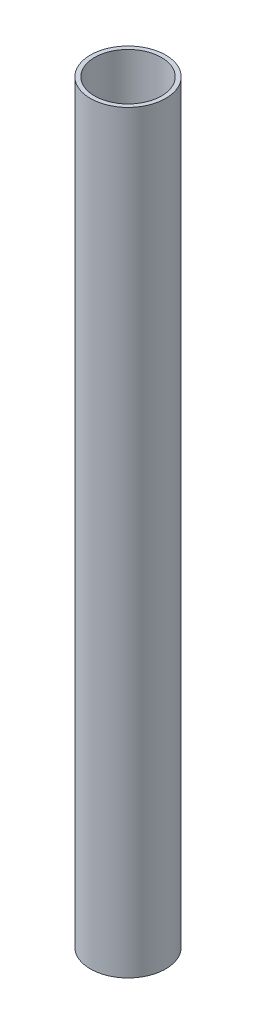
ISO-10303-21;
HEADER;
FILE_DESCRIPTION(('STEP AP214'),'2;1');
FILE_NAME('part.step','',(''),(''),'','','');
FILE_SCHEMA(('AUTOMOTIVE_DESIGN { 1 0 10303 214 1 1 1 1 }'));
ENDSEC;
DATA;
#1=APPLICATION_CONTEXT('core data for automotive mechanical design processes');
#2=APPLICATION_PROTOCOL_DEFINITION('international standard','automotive_design',2000,#1);
#3=PRODUCT_CONTEXT('',#1,'mechanical');
#4=PRODUCT('Part','Part','',(#3));
#5=PRODUCT_RELATED_PRODUCT_CATEGORY('part','',(#4));
#6=PRODUCT_DEFINITION_FORMATION('','',#4);
#7=PRODUCT_DEFINITION_CONTEXT('part definition',#1,'design');
#8=PRODUCT_DEFINITION('design','',#6,#7);
#9=PRODUCT_DEFINITION_SHAPE('','',#8);
#10=(LENGTH_UNIT() NAMED_UNIT(*) SI_UNIT(.MILLI.,.METRE.));
#11=(NAMED_UNIT(*) PLANE_ANGLE_UNIT() SI_UNIT($,.RADIAN.));
#12=(NAMED_UNIT(*) SI_UNIT($,.STERADIAN.) SOLID_ANGLE_UNIT());
#13=UNCERTAINTY_MEASURE_WITH_UNIT(LENGTH_MEASURE(1.E-05),#10,'distance_accuracy_value','');
#14=(GEOMETRIC_REPRESENTATION_CONTEXT(3) GLOBAL_UNCERTAINTY_ASSIGNED_CONTEXT((#13)) GLOBAL_UNIT_ASSIGNED_CONTEXT((#10,
#11,#12)) REPRESENTATION_CONTEXT('',''));
#15=CARTESIAN_POINT('',(0.,0.,0.));
#16=DIRECTION('',(0.,0.,1.));
#17=DIRECTION('',(1.,0.,0.));
#18=AXIS2_PLACEMENT_3D('',#15,#16,#17);
#19=CARTESIAN_POINT('',(0.,159.,0.));
#20=DIRECTION('',(0.,1.,0.));
#21=DIRECTION('',(0.,0.,1.));
#22=AXIS2_PLACEMENT_3D('',#19,#20,#21);
#23=PLANE('',#22);
#24=CARTESIAN_POINT('',(0.,159.,0.));
#25=DIRECTION('',(0.,1.,0.));
#26=DIRECTION('',(0.,0.,1.));
#27=AXIS2_PLACEMENT_3D('',#24,#25,#26);
#28=CIRCLE('',#27,7.9375);
#29=CARTESIAN_POINT('',(0.,159.,-7.9375));
#30=VERTEX_POINT('',#29);
#31=EDGE_CURVE('E10',#30,#30,#28,.T.);
#32=ORIENTED_EDGE('',*,*,#31,.T.);
#33=EDGE_LOOP('',(#32));
#34=FACE_BOUND('',#33,.T.);
#35=CARTESIAN_POINT('',(0.,159.,0.));
#36=DIRECTION('',(0.,1.,0.));
#37=DIRECTION('',(0.,0.,1.));
#38=AXIS2_PLACEMENT_3D('',#35,#36,#37);
#39=CIRCLE('',#38,7.0485);
#40=CARTESIAN_POINT('',(0.,159.,-7.0485));
#41=VERTEX_POINT('',#40);
#42=EDGE_CURVE('E44',#41,#41,#39,.T.);
#43=ORIENTED_EDGE('',*,*,#42,.F.);
#44=EDGE_LOOP('',(#43));
#45=FACE_BOUND('',#44,.T.);
#46=ADVANCED_FACE('F33',(#34,#45),#23,.T.);
#47=CARTESIAN_POINT('',(0.,0.,0.));
#48=DIRECTION('',(0.,1.,0.));
#49=DIRECTION('',(0.,0.,1.));
#50=AXIS2_PLACEMENT_3D('',#47,#48,#49);
#51=PLANE('',#50);
#52=CARTESIAN_POINT('',(0.,0.,0.));
#53=DIRECTION('',(0.,1.,0.));
#54=DIRECTION('',(0.,0.,1.));
#55=AXIS2_PLACEMENT_3D('',#52,#53,#54);
#56=CIRCLE('',#55,7.9375);
#57=CARTESIAN_POINT('',(0.,0.,-7.9375));
#58=VERTEX_POINT('',#57);
#59=EDGE_CURVE('E37',#58,#58,#56,.T.);
#60=ORIENTED_EDGE('',*,*,#59,.F.);
#61=EDGE_LOOP('',(#60));
#62=FACE_BOUND('',#61,.T.);
#63=CARTESIAN_POINT('',(0.,0.,0.));
#64=DIRECTION('',(0.,1.,0.));
#65=DIRECTION('',(0.,0.,1.));
#66=AXIS2_PLACEMENT_3D('',#63,#64,#65);
#67=CIRCLE('',#66,7.0485);
#68=CARTESIAN_POINT('',(0.,0.,-7.0485));
#69=VERTEX_POINT('',#68);
#70=EDGE_CURVE('E46',#69,#69,#67,.T.);
#71=ORIENTED_EDGE('',*,*,#70,.T.);
#72=EDGE_LOOP('',(#71));
#73=FACE_BOUND('',#72,.T.);
#74=ADVANCED_FACE('F56',(#62,#73),#51,.F.);
#75=CARTESIAN_POINT('',(0.,159.,0.));
#76=DIRECTION('',(0.,-1.,0.));
#77=DIRECTION('',(0.,0.,-1.));
#78=AXIS2_PLACEMENT_3D('',#75,#76,#77);
#79=CYLINDRICAL_SURFACE('',#78,7.9375);
#80=CARTESIAN_POINT('',(0.,159.,-7.9375));
#81=CARTESIAN_POINT('',(0.,157.34375,-7.9375));
#82=CARTESIAN_POINT('',(0.,155.6875,-7.9375));
#83=CARTESIAN_POINT('',(0.,152.375,-7.9375));
#84=CARTESIAN_POINT('',(0.,150.71875,-7.9375));
#85=CARTESIAN_POINT('',(0.,147.40625,-7.9375));
#86=CARTESIAN_POINT('',(0.,145.75,-7.9375));
#87=CARTESIAN_POINT('',(0.,142.4375,-7.9375));
#88=CARTESIAN_POINT('',(0.,140.78125,-7.9375));
#89=CARTESIAN_POINT('',(0.,137.46875,-7.9375));
#90=CARTESIAN_POINT('',(0.,135.8125,-7.9375));
#91=CARTESIAN_POINT('',(0.,132.5,-7.9375));
#92=CARTESIAN_POINT('',(0.,130.84375,-7.9375));
#93=CARTESIAN_POINT('',(0.,127.53125,-7.9375));
#94=CARTESIAN_POINT('',(0.,125.875,-7.9375));
#95=CARTESIAN_POINT('',(0.,122.5625,-7.9375));
#96=CARTESIAN_POINT('',(0.,120.90625,-7.9375));
#97=CARTESIAN_POINT('',(0.,117.59375,-7.9375));
#98=CARTESIAN_POINT('',(0.,115.9375,-7.9375));
#99=CARTESIAN_POINT('',(0.,112.625,-7.9375));
#100=CARTESIAN_POINT('',(0.,110.96875,-7.9375));
#101=CARTESIAN_POINT('',(0.,107.65625,-7.9375));
#102=CARTESIAN_POINT('',(0.,106.,-7.9375));
#103=CARTESIAN_POINT('',(0.,102.6875,-7.9375));
#104=CARTESIAN_POINT('',(0.,101.03125,-7.9375));
#105=CARTESIAN_POINT('',(0.,97.71875,-7.9375));
#106=CARTESIAN_POINT('',(0.,96.0625,-7.9375));
#107=CARTESIAN_POINT('',(0.,92.75,-7.9375));
#108=CARTESIAN_POINT('',(0.,91.09375,-7.9375));
#109=CARTESIAN_POINT('',(0.,87.78125,-7.9375));
#110=CARTESIAN_POINT('',(0.,86.125,-7.9375));
#111=CARTESIAN_POINT('',(0.,82.8125,-7.9375));
#112=CARTESIAN_POINT('',(0.,81.15625,-7.9375));
#113=CARTESIAN_POINT('',(0.,77.84375,-7.9375));
#114=CARTESIAN_POINT('',(0.,76.1875,-7.9375));
#115=CARTESIAN_POINT('',(0.,72.875,-7.9375));
#116=CARTESIAN_POINT('',(0.,71.21875,-7.9375));
#117=CARTESIAN_POINT('',(0.,67.90625,-7.9375));
#118=CARTESIAN_POINT('',(0.,66.25,-7.9375));
#119=CARTESIAN_POINT('',(0.,62.9375,-7.9375));
#120=CARTESIAN_POINT('',(0.,61.28125,-7.9375));
#121=CARTESIAN_POINT('',(0.,57.96875,-7.9375));
#122=CARTESIAN_POINT('',(0.,56.3125,-7.9375));
#123=CARTESIAN_POINT('',(0.,53.,-7.9375));
#124=CARTESIAN_POINT('',(0.,51.34375,-7.9375));
#125=CARTESIAN_POINT('',(0.,48.03125,-7.9375));
#126=CARTESIAN_POINT('',(0.,46.375,-7.9375));
#127=CARTESIAN_POINT('',(0.,43.0625,-7.9375));
#128=CARTESIAN_POINT('',(0.,41.40625,-7.9375));
#129=CARTESIAN_POINT('',(0.,38.09375,-7.9375));
#130=CARTESIAN_POINT('',(0.,36.4375,-7.9375));
#131=CARTESIAN_POINT('',(0.,33.125,-7.9375));
#132=CARTESIAN_POINT('',(0.,31.46875,-7.9375));
#133=CARTESIAN_POINT('',(0.,28.15625,-7.9375));
#134=CARTESIAN_POINT('',(0.,26.5,-7.9375));
#135=CARTESIAN_POINT('',(0.,23.1875,-7.9375));
#136=CARTESIAN_POINT('',(0.,21.53125,-7.9375));
#137=CARTESIAN_POINT('',(0.,18.21875,-7.9375));
#138=CARTESIAN_POINT('',(0.,16.5625,-7.9375));
#139=CARTESIAN_POINT('',(0.,13.25,-7.9375));
#140=CARTESIAN_POINT('',(0.,11.59375,-7.9375));
#141=CARTESIAN_POINT('',(0.,8.28124999999999,-7.9375));
#142=CARTESIAN_POINT('',(0.,6.62499999999999,-7.9375));
#143=CARTESIAN_POINT('',(0.,3.3125,-7.9375));
#144=CARTESIAN_POINT('',(0.,1.65625,-7.9375));
#145=CARTESIAN_POINT('',(0.,0.,-7.9375));
#146=B_SPLINE_CURVE_WITH_KNOTS('',3,(#80,#81,#82,#83,#84,#85,#86,#87,#88,#89,#90,#91,#92,#93,
#94,#95,#96,#97,#98,#99,#100,#101,#102,#103,#104,#105,#106,#107,#108,#109,#110,#111,#112,#113,
#114,#115,#116,#117,#118,#119,#120,#121,#122,#123,#124,#125,#126,#127,#128,#129,#130,#131,#132,
#133,#134,#135,#136,#137,#138,#139,#140,#141,#142,#143,#144,#145),.UNSPECIFIED.,.F.,.F.,(4,2,2,
2,2,2,2,2,2,2,2,2,2,2,2,2,2,2,2,2,2,2,2,2,2,2,2,2,2,2,2,2,4),(0.,4.96875000000002,
9.93750000000002,14.90625,19.875,24.84375,29.8125,34.78125,39.75,44.71875,49.6875,54.65625,
59.625,64.59375,69.5625,74.53125,79.5,84.46875,89.4375,94.40625,99.375,104.34375,109.3125,
114.28125,119.25,124.21875,129.1875,134.15625,139.125,144.09375,149.0625,154.03125,159.),.UNSPECIFIED.);
#147=EDGE_CURVE('BSEAM35',#30,#58,#146,.T.);
#148=ORIENTED_EDGE('',*,*,#31,.F.);
#149=ORIENTED_EDGE('',*,*,#59,.T.);
#150=ORIENTED_EDGE('',*,*,#147,.T.);
#151=ORIENTED_EDGE('',*,*,#147,.F.);
#152=EDGE_LOOP('',(#148,#150,#149,#151));
#153=FACE_BOUND('',#152,.T.);
#154=ADVANCED_FACE('F35',(#153),#79,.T.);
#155=CARTESIAN_POINT('',(0.,159.,0.));
#156=DIRECTION('',(0.,-1.,0.));
#157=DIRECTION('',(0.,0.,-1.));
#158=AXIS2_PLACEMENT_3D('',#155,#156,#157);
#159=CYLINDRICAL_SURFACE('',#158,7.0485);
#160=CARTESIAN_POINT('',(0.,159.,-7.0485));
#161=CARTESIAN_POINT('',(0.,157.34375,-7.0485));
#162=CARTESIAN_POINT('',(0.,155.6875,-7.0485));
#163=CARTESIAN_POINT('',(0.,152.375,-7.0485));
#164=CARTESIAN_POINT('',(0.,150.71875,-7.0485));
#165=CARTESIAN_POINT('',(0.,147.40625,-7.0485));
#166=CARTESIAN_POINT('',(0.,145.75,-7.0485));
#167=CARTESIAN_POINT('',(0.,142.4375,-7.0485));
#168=CARTESIAN_POINT('',(0.,140.78125,-7.0485));
#169=CARTESIAN_POINT('',(0.,137.46875,-7.0485));
#170=CARTESIAN_POINT('',(0.,135.8125,-7.0485));
#171=CARTESIAN_POINT('',(0.,132.5,-7.0485));
#172=CARTESIAN_POINT('',(0.,130.84375,-7.0485));
#173=CARTESIAN_POINT('',(0.,127.53125,-7.0485));
#174=CARTESIAN_POINT('',(0.,125.875,-7.0485));
#175=CARTESIAN_POINT('',(0.,122.5625,-7.0485));
#176=CARTESIAN_POINT('',(0.,120.90625,-7.0485));
#177=CARTESIAN_POINT('',(0.,117.59375,-7.0485));
#178=CARTESIAN_POINT('',(0.,115.9375,-7.0485));
#179=CARTESIAN_POINT('',(0.,112.625,-7.0485));
#180=CARTESIAN_POINT('',(0.,110.96875,-7.0485));
#181=CARTESIAN_POINT('',(0.,107.65625,-7.0485));
#182=CARTESIAN_POINT('',(0.,106.,-7.0485));
#183=CARTESIAN_POINT('',(0.,102.6875,-7.0485));
#184=CARTESIAN_POINT('',(0.,101.03125,-7.0485));
#185=CARTESIAN_POINT('',(0.,97.71875,-7.0485));
#186=CARTESIAN_POINT('',(0.,96.0625,-7.0485));
#187=CARTESIAN_POINT('',(0.,92.75,-7.0485));
#188=CARTESIAN_POINT('',(0.,91.09375,-7.0485));
#189=CARTESIAN_POINT('',(0.,87.78125,-7.0485));
#190=CARTESIAN_POINT('',(0.,86.125,-7.0485));
#191=CARTESIAN_POINT('',(0.,82.8125,-7.0485));
#192=CARTESIAN_POINT('',(0.,81.15625,-7.0485));
#193=CARTESIAN_POINT('',(0.,77.84375,-7.0485));
#194=CARTESIAN_POINT('',(0.,76.1875,-7.0485));
#195=CARTESIAN_POINT('',(0.,72.875,-7.0485));
#196=CARTESIAN_POINT('',(0.,71.21875,-7.0485));
#197=CARTESIAN_POINT('',(0.,67.90625,-7.0485));
#198=CARTESIAN_POINT('',(0.,66.25,-7.0485));
#199=CARTESIAN_POINT('',(0.,62.9375,-7.0485));
#200=CARTESIAN_POINT('',(0.,61.28125,-7.0485));
#201=CARTESIAN_POINT('',(0.,57.96875,-7.0485));
#202=CARTESIAN_POINT('',(0.,56.3125,-7.0485));
#203=CARTESIAN_POINT('',(0.,53.,-7.0485));
#204=CARTESIAN_POINT('',(0.,51.34375,-7.0485));
#205=CARTESIAN_POINT('',(0.,48.03125,-7.0485));
#206=CARTESIAN_POINT('',(0.,46.375,-7.0485));
#207=CARTESIAN_POINT('',(0.,43.0625,-7.0485));
#208=CARTESIAN_POINT('',(0.,41.40625,-7.0485));
#209=CARTESIAN_POINT('',(0.,38.09375,-7.0485));
#210=CARTESIAN_POINT('',(0.,36.4375,-7.0485));
#211=CARTESIAN_POINT('',(0.,33.125,-7.0485));
#212=CARTESIAN_POINT('',(0.,31.46875,-7.0485));
#213=CARTESIAN_POINT('',(0.,28.15625,-7.0485));
#214=CARTESIAN_POINT('',(0.,26.5,-7.0485));
#215=CARTESIAN_POINT('',(0.,23.1875,-7.0485));
#216=CARTESIAN_POINT('',(0.,21.53125,-7.0485));
#217=CARTESIAN_POINT('',(0.,18.21875,-7.0485));
#218=CARTESIAN_POINT('',(0.,16.5625,-7.0485));
#219=CARTESIAN_POINT('',(0.,13.25,-7.0485));
#220=CARTESIAN_POINT('',(0.,11.59375,-7.0485));
#221=CARTESIAN_POINT('',(0.,8.28124999999999,-7.0485));
#222=CARTESIAN_POINT('',(0.,6.62499999999999,-7.0485));
#223=CARTESIAN_POINT('',(0.,3.3125,-7.0485));
#224=CARTESIAN_POINT('',(0.,1.65625,-7.0485));
#225=CARTESIAN_POINT('',(0.,0.,-7.0485));
#226=B_SPLINE_CURVE_WITH_KNOTS('',3,(#160,#161,#162,#163,#164,#165,#166,#167,#168,#169,#170,
#171,#172,#173,#174,#175,#176,#177,#178,#179,#180,#181,#182,#183,#184,#185,#186,#187,#188,#189,
#190,#191,#192,#193,#194,#195,#196,#197,#198,#199,#200,#201,#202,#203,#204,#205,#206,#207,#208,
#209,#210,#211,#212,#213,#214,#215,#216,#217,#218,#219,#220,#221,#222,#223,#224,#225),
.UNSPECIFIED.,.F.,.F.,(4,2,2,2,2,2,2,2,2,2,2,2,2,2,2,2,2,2,2,2,2,2,2,2,2,2,2,2,2,2,2,2,4),(0.,
4.96874999999999,9.93749999999999,14.90625,19.875,24.84375,29.8125,34.78125,39.75,44.71875,
49.6875,54.65625,59.625,64.59375,69.5625,74.53125,79.5,84.46875,89.4375,94.40625,99.375,
104.34375,109.3125,114.28125,119.25,124.21875,129.1875,134.15625,139.125,144.09375,149.0625,
154.03125,159.),.UNSPECIFIED.);
#227=EDGE_CURVE('BSEAM52',#41,#69,#226,.T.);
#228=ORIENTED_EDGE('',*,*,#42,.T.);
#229=ORIENTED_EDGE('',*,*,#70,.F.);
#230=ORIENTED_EDGE('',*,*,#227,.T.);
#231=ORIENTED_EDGE('',*,*,#227,.F.);
#232=EDGE_LOOP('',(#228,#230,#229,#231));
#233=FACE_BOUND('',#232,.T.);
#234=ADVANCED_FACE('F52',(#233),#159,.F.);
#235=CLOSED_SHELL('',(#46,#74,#154,#234));
#236=MANIFOLD_SOLID_BREP('B2',#235);
#237=ADVANCED_BREP_SHAPE_REPRESENTATION('',(#18,#236),#14);
#238=SHAPE_DEFINITION_REPRESENTATION(#9,#237);
ENDSEC;
END-ISO-10303-21;
